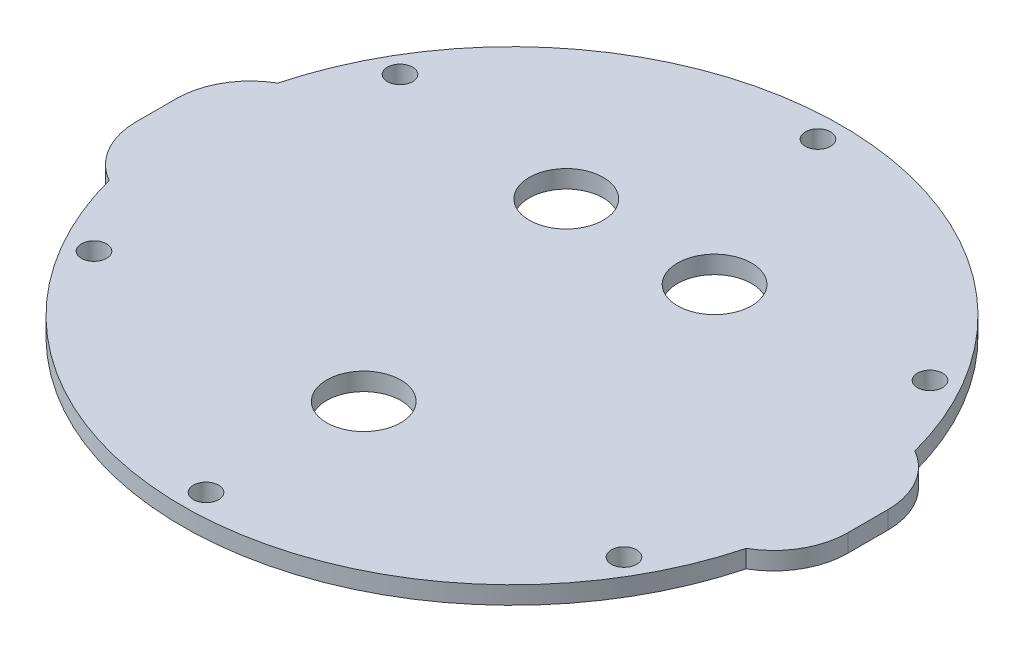
ISO-10303-21;
HEADER;
FILE_DESCRIPTION(('STEP AP214'),'2;1');
FILE_NAME('part.step','',(''),(''),'','','');
FILE_SCHEMA(('AUTOMOTIVE_DESIGN { 1 0 10303 214 1 1 1 1 }'));
ENDSEC;
DATA;
#1=APPLICATION_CONTEXT('core data for automotive mechanical design processes');
#2=APPLICATION_PROTOCOL_DEFINITION('international standard','automotive_design',2000,#1);
#3=PRODUCT_CONTEXT('',#1,'mechanical');
#4=PRODUCT('Part','Part','',(#3));
#5=PRODUCT_RELATED_PRODUCT_CATEGORY('part','',(#4));
#6=PRODUCT_DEFINITION_FORMATION('','',#4);
#7=PRODUCT_DEFINITION_CONTEXT('part definition',#1,'design');
#8=PRODUCT_DEFINITION('design','',#6,#7);
#9=PRODUCT_DEFINITION_SHAPE('','',#8);
#10=(LENGTH_UNIT() NAMED_UNIT(*) SI_UNIT(.MILLI.,.METRE.));
#11=(NAMED_UNIT(*) PLANE_ANGLE_UNIT() SI_UNIT($,.RADIAN.));
#12=(NAMED_UNIT(*) SI_UNIT($,.STERADIAN.) SOLID_ANGLE_UNIT());
#13=UNCERTAINTY_MEASURE_WITH_UNIT(LENGTH_MEASURE(1.E-05),#10,'distance_accuracy_value','');
#14=(GEOMETRIC_REPRESENTATION_CONTEXT(3) GLOBAL_UNCERTAINTY_ASSIGNED_CONTEXT((#13)) GLOBAL_UNIT_ASSIGNED_CONTEXT((#10,
#11,#12)) REPRESENTATION_CONTEXT('',''));
#15=CARTESIAN_POINT('',(0.,0.,0.));
#16=DIRECTION('',(0.,0.,1.));
#17=DIRECTION('',(1.,0.,0.));
#18=AXIS2_PLACEMENT_3D('',#15,#16,#17);
#19=CARTESIAN_POINT('',(-38.,2.4,2.7));
#20=DIRECTION('',(0.,-1.,0.));
#21=DIRECTION('',(0.,0.,-1.));
#22=AXIS2_PLACEMENT_3D('',#19,#20,#21);
#23=CYLINDRICAL_SURFACE('',#22,10.);
#24=CARTESIAN_POINT('',(-38.,0.,2.7));
#25=DIRECTION('',(0.,1.,0.));
#26=DIRECTION('',(0.,0.,1.));
#27=AXIS2_PLACEMENT_3D('',#24,#25,#26);
#28=CIRCLE('',#27,10.);
#29=CARTESIAN_POINT('',(-42.969094343859,0.,11.3780240493922));
#30=VERTEX_POINT('',#29);
#31=CARTESIAN_POINT('',(-48.,0.,2.69999999999993));
#32=VERTEX_POINT('',#31);
#33=EDGE_CURVE('E139',#30,#32,#28,.F.);
#34=ORIENTED_EDGE('',*,*,#33,.F.);
#35=DIRECTION('',(0.,-1.,0.));
#36=VECTOR('',#35,1.);
#37=CARTESIAN_POINT('',(-42.969094343859,2.4,11.3780240493922));
#38=LINE('',#37,#36);
#39=CARTESIAN_POINT('',(-42.969094343859,2.4,11.3780240493922));
#40=VERTEX_POINT('',#39);
#41=EDGE_CURVE('E11',#40,#30,#38,.T.);
#42=ORIENTED_EDGE('',*,*,#41,.F.);
#43=CARTESIAN_POINT('',(-38.,2.4,2.7));
#44=DIRECTION('',(0.,1.,0.));
#45=DIRECTION('',(0.,0.,1.));
#46=AXIS2_PLACEMENT_3D('',#43,#44,#45);
#47=CIRCLE('',#46,10.);
#48=CARTESIAN_POINT('',(-48.,2.4,2.69999999999993));
#49=VERTEX_POINT('',#48);
#50=EDGE_CURVE('E166',#40,#49,#47,.F.);
#51=ORIENTED_EDGE('',*,*,#50,.T.);
#52=DIRECTION('',(0.,-1.,0.));
#53=VECTOR('',#52,1.);
#54=CARTESIAN_POINT('',(-48.,2.4,2.69999999999993));
#55=LINE('',#54,#53);
#56=EDGE_CURVE('E93',#49,#32,#55,.T.);
#57=ORIENTED_EDGE('',*,*,#56,.T.);
#58=EDGE_LOOP('',(#34,#42,#51,#57));
#59=FACE_BOUND('',#58,.T.);
#60=ADVANCED_FACE('F41',(#59),#23,.T.);
#61=CARTESIAN_POINT('',(0.,2.4,0.));
#62=DIRECTION('',(0.,-1.,0.));
#63=DIRECTION('',(0.,0.,-1.));
#64=AXIS2_PLACEMENT_3D('',#61,#62,#63);
#65=CYLINDRICAL_SURFACE('',#64,44.45);
#66=CARTESIAN_POINT('',(0.,0.,0.));
#67=DIRECTION('',(0.,1.,0.));
#68=DIRECTION('',(0.,0.,1.));
#69=AXIS2_PLACEMENT_3D('',#66,#67,#68);
#70=CIRCLE('',#69,44.45);
#71=CARTESIAN_POINT('',(42.969094343859,0.,11.3780240493922));
#72=VERTEX_POINT('',#71);
#73=EDGE_CURVE('E143',#30,#72,#70,.T.);
#74=ORIENTED_EDGE('',*,*,#73,.T.);
#75=DIRECTION('',(0.,-1.,0.));
#76=VECTOR('',#75,1.);
#77=CARTESIAN_POINT('',(42.969094343859,2.4,11.3780240493922));
#78=LINE('',#77,#76);
#79=CARTESIAN_POINT('',(42.969094343859,2.4,11.3780240493922));
#80=VERTEX_POINT('',#79);
#81=EDGE_CURVE('E50',#80,#72,#78,.T.);
#82=ORIENTED_EDGE('',*,*,#81,.F.);
#83=CARTESIAN_POINT('',(0.,2.4,0.));
#84=DIRECTION('',(0.,1.,0.));
#85=DIRECTION('',(0.,0.,1.));
#86=AXIS2_PLACEMENT_3D('',#83,#84,#85);
#87=CIRCLE('',#86,44.45);
#88=EDGE_CURVE('E201',#40,#80,#87,.T.);
#89=ORIENTED_EDGE('',*,*,#88,.F.);
#90=ORIENTED_EDGE('',*,*,#41,.T.);
#91=EDGE_LOOP('',(#74,#82,#89,#90));
#92=FACE_BOUND('',#91,.T.);
#93=ADVANCED_FACE('F325',(#92),#65,.T.);
#94=CARTESIAN_POINT('',(38.,2.4,2.7));
#95=DIRECTION('',(0.,-1.,0.));
#96=DIRECTION('',(0.,0.,-1.));
#97=AXIS2_PLACEMENT_3D('',#94,#95,#96);
#98=CYLINDRICAL_SURFACE('',#97,10.);
#99=CARTESIAN_POINT('',(38.,0.,2.7));
#100=DIRECTION('',(0.,1.,0.));
#101=DIRECTION('',(0.,0.,1.));
#102=AXIS2_PLACEMENT_3D('',#99,#100,#101);
#103=CIRCLE('',#102,10.);
#104=CARTESIAN_POINT('',(48.,0.,2.69999999999993));
#105=VERTEX_POINT('',#104);
#106=EDGE_CURVE('E147',#72,#105,#103,.T.);
#107=ORIENTED_EDGE('',*,*,#106,.T.);
#108=DIRECTION('',(0.,-1.,0.));
#109=VECTOR('',#108,1.);
#110=CARTESIAN_POINT('',(48.,2.4,2.69999999999993));
#111=LINE('',#110,#109);
#112=CARTESIAN_POINT('',(48.,2.4,2.69999999999993));
#113=VERTEX_POINT('',#112);
#114=EDGE_CURVE('E176',#113,#105,#111,.T.);
#115=ORIENTED_EDGE('',*,*,#114,.F.);
#116=CARTESIAN_POINT('',(38.,2.4,2.7));
#117=DIRECTION('',(0.,1.,0.));
#118=DIRECTION('',(0.,0.,1.));
#119=AXIS2_PLACEMENT_3D('',#116,#117,#118);
#120=CIRCLE('',#119,10.);
#121=EDGE_CURVE('E186',#80,#113,#120,.T.);
#122=ORIENTED_EDGE('',*,*,#121,.F.);
#123=ORIENTED_EDGE('',*,*,#81,.T.);
#124=EDGE_LOOP('',(#107,#115,#122,#123));
#125=FACE_BOUND('',#124,.T.);
#126=ADVANCED_FACE('F184',(#125),#98,.T.);
#127=CARTESIAN_POINT('',(48.,2.4,0.));
#128=DIRECTION('',(1.,0.,0.));
#129=DIRECTION('',(0.,0.,-1.));
#130=AXIS2_PLACEMENT_3D('',#127,#128,#129);
#131=PLANE('',#130);
#132=DIRECTION('',(0.,0.,1.));
#133=VECTOR('',#132,1.);
#134=CARTESIAN_POINT('',(48.,0.,0.));
#135=LINE('',#134,#133);
#136=CARTESIAN_POINT('',(48.,0.,-2.69999999999993));
#137=VERTEX_POINT('',#136);
#138=EDGE_CURVE('E151',#137,#105,#135,.T.);
#139=ORIENTED_EDGE('',*,*,#138,.F.);
#140=DIRECTION('',(0.,-1.,0.));
#141=VECTOR('',#140,1.);
#142=CARTESIAN_POINT('',(48.,2.4,-2.69999999999993));
#143=LINE('',#142,#141);
#144=CARTESIAN_POINT('',(48.,2.4,-2.69999999999993));
#145=VERTEX_POINT('',#144);
#146=EDGE_CURVE('E173',#145,#137,#143,.T.);
#147=ORIENTED_EDGE('',*,*,#146,.F.);
#148=DIRECTION('',(0.,0.,1.));
#149=VECTOR('',#148,1.);
#150=CARTESIAN_POINT('',(48.,2.4,0.));
#151=LINE('',#150,#149);
#152=EDGE_CURVE('E196',#145,#113,#151,.T.);
#153=ORIENTED_EDGE('',*,*,#152,.T.);
#154=ORIENTED_EDGE('',*,*,#114,.T.);
#155=EDGE_LOOP('',(#139,#147,#153,#154));
#156=FACE_BOUND('',#155,.T.);
#157=ADVANCED_FACE('F194',(#156),#131,.T.);
#158=CARTESIAN_POINT('',(38.,2.4,-2.7));
#159=DIRECTION('',(0.,-1.,0.));
#160=DIRECTION('',(0.,0.,-1.));
#161=AXIS2_PLACEMENT_3D('',#158,#159,#160);
#162=CYLINDRICAL_SURFACE('',#161,10.);
#163=CARTESIAN_POINT('',(38.,0.,-2.7));
#164=DIRECTION('',(0.,1.,0.));
#165=DIRECTION('',(0.,0.,1.));
#166=AXIS2_PLACEMENT_3D('',#163,#164,#165);
#167=CIRCLE('',#166,10.);
#168=CARTESIAN_POINT('',(42.969094343859,0.,-11.3780240493922));
#169=VERTEX_POINT('',#168);
#170=EDGE_CURVE('E155',#169,#137,#167,.F.);
#171=ORIENTED_EDGE('',*,*,#170,.F.);
#172=DIRECTION('',(0.,-1.,0.));
#173=VECTOR('',#172,1.);
#174=CARTESIAN_POINT('',(42.969094343859,2.4,-11.3780240493922));
#175=LINE('',#174,#173);
#176=CARTESIAN_POINT('',(42.969094343859,2.4,-11.3780240493922));
#177=VERTEX_POINT('',#176);
#178=EDGE_CURVE('E129',#177,#169,#175,.T.);
#179=ORIENTED_EDGE('',*,*,#178,.F.);
#180=CARTESIAN_POINT('',(38.,2.4,-2.7));
#181=DIRECTION('',(0.,1.,0.));
#182=DIRECTION('',(0.,0.,1.));
#183=AXIS2_PLACEMENT_3D('',#180,#181,#182);
#184=CIRCLE('',#183,10.);
#185=EDGE_CURVE('E120',#177,#145,#184,.F.);
#186=ORIENTED_EDGE('',*,*,#185,.T.);
#187=ORIENTED_EDGE('',*,*,#146,.T.);
#188=EDGE_LOOP('',(#171,#179,#186,#187));
#189=FACE_BOUND('',#188,.T.);
#190=ADVANCED_FACE('F340',(#189),#162,.T.);
#191=CARTESIAN_POINT('',(0.,2.4,0.));
#192=DIRECTION('',(0.,-1.,0.));
#193=DIRECTION('',(0.,0.,-1.));
#194=AXIS2_PLACEMENT_3D('',#191,#192,#193);
#195=CYLINDRICAL_SURFACE('',#194,44.45);
#196=CARTESIAN_POINT('',(0.,0.,0.));
#197=DIRECTION('',(0.,1.,0.));
#198=DIRECTION('',(0.,0.,1.));
#199=AXIS2_PLACEMENT_3D('',#196,#197,#198);
#200=CIRCLE('',#199,44.45);
#201=CARTESIAN_POINT('',(-42.969094343859,0.,-11.3780240493922));
#202=VERTEX_POINT('',#201);
#203=EDGE_CURVE('E127',#169,#202,#200,.T.);
#204=ORIENTED_EDGE('',*,*,#203,.T.);
#205=DIRECTION('',(0.,-1.,0.));
#206=VECTOR('',#205,1.);
#207=CARTESIAN_POINT('',(-42.969094343859,2.4,-11.3780240493922));
#208=LINE('',#207,#206);
#209=CARTESIAN_POINT('',(-42.969094343859,2.4,-11.3780240493922));
#210=VERTEX_POINT('',#209);
#211=EDGE_CURVE('E124',#210,#202,#208,.T.);
#212=ORIENTED_EDGE('',*,*,#211,.F.);
#213=CARTESIAN_POINT('',(0.,2.4,0.));
#214=DIRECTION('',(0.,1.,0.));
#215=DIRECTION('',(0.,0.,1.));
#216=AXIS2_PLACEMENT_3D('',#213,#214,#215);
#217=CIRCLE('',#216,44.45);
#218=EDGE_CURVE('E113',#177,#210,#217,.T.);
#219=ORIENTED_EDGE('',*,*,#218,.F.);
#220=ORIENTED_EDGE('',*,*,#178,.T.);
#221=EDGE_LOOP('',(#204,#212,#219,#220));
#222=FACE_BOUND('',#221,.T.);
#223=ADVANCED_FACE('F125',(#222),#195,.T.);
#224=CARTESIAN_POINT('',(-38.,2.4,-2.7));
#225=DIRECTION('',(0.,-1.,0.));
#226=DIRECTION('',(0.,0.,-1.));
#227=AXIS2_PLACEMENT_3D('',#224,#225,#226);
#228=CYLINDRICAL_SURFACE('',#227,10.);
#229=CARTESIAN_POINT('',(-38.,0.,-2.7));
#230=DIRECTION('',(0.,1.,0.));
#231=DIRECTION('',(0.,0.,1.));
#232=AXIS2_PLACEMENT_3D('',#229,#230,#231);
#233=CIRCLE('',#232,10.);
#234=CARTESIAN_POINT('',(-48.,0.,-2.69999999999993));
#235=VERTEX_POINT('',#234);
#236=EDGE_CURVE('E86',#202,#235,#233,.T.);
#237=ORIENTED_EDGE('',*,*,#236,.T.);
#238=DIRECTION('',(0.,-1.,0.));
#239=VECTOR('',#238,1.);
#240=CARTESIAN_POINT('',(-48.,2.4,-2.69999999999993));
#241=LINE('',#240,#239);
#242=CARTESIAN_POINT('',(-48.,2.4,-2.69999999999993));
#243=VERTEX_POINT('',#242);
#244=EDGE_CURVE('E130',#243,#235,#241,.T.);
#245=ORIENTED_EDGE('',*,*,#244,.F.);
#246=CARTESIAN_POINT('',(-38.,2.4,-2.7));
#247=DIRECTION('',(0.,1.,0.));
#248=DIRECTION('',(0.,0.,1.));
#249=AXIS2_PLACEMENT_3D('',#246,#247,#248);
#250=CIRCLE('',#249,10.);
#251=EDGE_CURVE('E117',#210,#243,#250,.T.);
#252=ORIENTED_EDGE('',*,*,#251,.F.);
#253=ORIENTED_EDGE('',*,*,#211,.T.);
#254=EDGE_LOOP('',(#237,#245,#252,#253));
#255=FACE_BOUND('',#254,.T.);
#256=ADVANCED_FACE('F132',(#255),#228,.T.);
#257=CARTESIAN_POINT('',(-48.,2.4,0.));
#258=DIRECTION('',(1.,0.,0.));
#259=DIRECTION('',(0.,0.,-1.));
#260=AXIS2_PLACEMENT_3D('',#257,#258,#259);
#261=PLANE('',#260);
#262=DIRECTION('',(0.,0.,1.));
#263=VECTOR('',#262,1.);
#264=CARTESIAN_POINT('',(-48.,0.,0.));
#265=LINE('',#264,#263);
#266=EDGE_CURVE('E163',#235,#32,#265,.T.);
#267=ORIENTED_EDGE('',*,*,#266,.T.);
#268=ORIENTED_EDGE('',*,*,#56,.F.);
#269=DIRECTION('',(0.,0.,1.));
#270=VECTOR('',#269,1.);
#271=CARTESIAN_POINT('',(-48.,2.4,0.));
#272=LINE('',#271,#270);
#273=EDGE_CURVE('E58',#243,#49,#272,.T.);
#274=ORIENTED_EDGE('',*,*,#273,.F.);
#275=ORIENTED_EDGE('',*,*,#244,.T.);
#276=EDGE_LOOP('',(#267,#268,#274,#275));
#277=FACE_BOUND('',#276,.T.);
#278=ADVANCED_FACE('F292',(#277),#261,.F.);
#279=CARTESIAN_POINT('',(0.,2.4,0.));
#280=DIRECTION('',(0.,1.,0.));
#281=DIRECTION('',(0.,0.,1.));
#282=AXIS2_PLACEMENT_3D('',#279,#280,#281);
#283=PLANE('',#282);
#284=CARTESIAN_POINT('',(10.,2.4,-17.3205080756888));
#285=DIRECTION('',(0.,1.,0.));
#286=DIRECTION('',(0.,0.,-1.));
#287=AXIS2_PLACEMENT_3D('',#284,#285,#286);
#288=CIRCLE('',#287,5.);
#289=CARTESIAN_POINT('',(10.,2.4,-22.3205080756888));
#290=VERTEX_POINT('',#289);
#291=EDGE_CURVE('E264',#290,#290,#288,.T.);
#292=ORIENTED_EDGE('',*,*,#291,.F.);
#293=EDGE_LOOP('',(#292));
#294=FACE_BOUND('',#293,.T.);
#295=CARTESIAN_POINT('',(0.,2.4,20.));
#296=DIRECTION('',(0.,1.,0.));
#297=DIRECTION('',(0.,0.,1.));
#298=AXIS2_PLACEMENT_3D('',#295,#296,#297);
#299=CIRCLE('',#298,5.);
#300=CARTESIAN_POINT('',(0.,2.4,25.));
#301=VERTEX_POINT('',#300);
#302=EDGE_CURVE('E272',#301,#301,#299,.T.);
#303=ORIENTED_EDGE('',*,*,#302,.F.);
#304=EDGE_LOOP('',(#303));
#305=FACE_BOUND('',#304,.T.);
#306=CARTESIAN_POINT('',(-10.,2.4,-17.3205080756888));
#307=DIRECTION('',(0.,1.,0.));
#308=DIRECTION('',(0.,0.,1.));
#309=AXIS2_PLACEMENT_3D('',#306,#307,#308);
#310=CIRCLE('',#309,5.);
#311=CARTESIAN_POINT('',(-10.,2.4,-12.3205080756888));
#312=VERTEX_POINT('',#311);
#313=EDGE_CURVE('E256',#312,#312,#310,.T.);
#314=ORIENTED_EDGE('',*,*,#313,.F.);
#315=EDGE_LOOP('',(#314));
#316=FACE_BOUND('',#315,.T.);
#317=CARTESIAN_POINT('',(35.7451985412025,2.4,-20.6375000000004));
#318=DIRECTION('',(0.,1.,0.));
#319=DIRECTION('',(0.,0.,1.));
#320=AXIS2_PLACEMENT_3D('',#317,#318,#319);
#321=CIRCLE('',#320,1.69999999999999);
#322=CARTESIAN_POINT('',(35.7451985412025,2.4,-18.9375000000004));
#323=VERTEX_POINT('',#322);
#324=EDGE_CURVE('E251',#323,#323,#321,.T.);
#325=ORIENTED_EDGE('',*,*,#324,.F.);
#326=EDGE_LOOP('',(#325));
#327=FACE_BOUND('',#326,.T.);
#328=CARTESIAN_POINT('',(35.7451985412029,2.4,20.6374999999997));
#329=DIRECTION('',(0.,1.,0.));
#330=DIRECTION('',(0.,0.,1.));
#331=AXIS2_PLACEMENT_3D('',#328,#329,#330);
#332=CIRCLE('',#331,1.69999999999999);
#333=CARTESIAN_POINT('',(35.7451985412029,2.4,22.3374999999997));
#334=VERTEX_POINT('',#333);
#335=EDGE_CURVE('E243',#334,#334,#332,.T.);
#336=ORIENTED_EDGE('',*,*,#335,.F.);
#337=EDGE_LOOP('',(#336));
#338=FACE_BOUND('',#337,.T.);
#339=CARTESIAN_POINT('',(0.,2.4,41.275));
#340=DIRECTION('',(0.,1.,0.));
#341=DIRECTION('',(0.,0.,1.));
#342=AXIS2_PLACEMENT_3D('',#339,#340,#341);
#343=CIRCLE('',#342,1.69999999999999);
#344=CARTESIAN_POINT('',(0.,2.4,42.975));
#345=VERTEX_POINT('',#344);
#346=EDGE_CURVE('E235',#345,#345,#343,.T.);
#347=ORIENTED_EDGE('',*,*,#346,.F.);
#348=EDGE_LOOP('',(#347));
#349=FACE_BOUND('',#348,.T.);
#350=CARTESIAN_POINT('',(-35.7451985412026,2.4,20.6375000000002));
#351=DIRECTION('',(0.,1.,0.));
#352=DIRECTION('',(0.,0.,1.));
#353=AXIS2_PLACEMENT_3D('',#350,#351,#352);
#354=CIRCLE('',#353,1.69999999999999);
#355=CARTESIAN_POINT('',(-35.7451985412026,2.4,22.3375000000002));
#356=VERTEX_POINT('',#355);
#357=EDGE_CURVE('E227',#356,#356,#354,.T.);
#358=ORIENTED_EDGE('',*,*,#357,.F.);
#359=EDGE_LOOP('',(#358));
#360=FACE_BOUND('',#359,.T.);
#361=CARTESIAN_POINT('',(-35.7451985412028,2.4,-20.6374999999999));
#362=DIRECTION('',(0.,1.,0.));
#363=DIRECTION('',(0.,0.,1.));
#364=AXIS2_PLACEMENT_3D('',#361,#362,#363);
#365=CIRCLE('',#364,1.69999999999999);
#366=CARTESIAN_POINT('',(-35.7451985412028,2.4,-18.9374999999999));
#367=VERTEX_POINT('',#366);
#368=EDGE_CURVE('E219',#367,#367,#365,.T.);
#369=ORIENTED_EDGE('',*,*,#368,.F.);
#370=EDGE_LOOP('',(#369));
#371=FACE_BOUND('',#370,.T.);
#372=CARTESIAN_POINT('',(0.,2.4,-41.275));
#373=DIRECTION('',(0.,1.,0.));
#374=DIRECTION('',(0.,0.,1.));
#375=AXIS2_PLACEMENT_3D('',#372,#373,#374);
#376=CIRCLE('',#375,1.69999999999999);
#377=CARTESIAN_POINT('',(0.,2.4,-39.575));
#378=VERTEX_POINT('',#377);
#379=EDGE_CURVE('E211',#378,#378,#376,.T.);
#380=ORIENTED_EDGE('',*,*,#379,.F.);
#381=EDGE_LOOP('',(#380));
#382=FACE_BOUND('',#381,.T.);
#383=ORIENTED_EDGE('',*,*,#50,.F.);
#384=ORIENTED_EDGE('',*,*,#88,.T.);
#385=ORIENTED_EDGE('',*,*,#121,.T.);
#386=ORIENTED_EDGE('',*,*,#152,.F.);
#387=ORIENTED_EDGE('',*,*,#185,.F.);
#388=ORIENTED_EDGE('',*,*,#218,.T.);
#389=ORIENTED_EDGE('',*,*,#251,.T.);
#390=ORIENTED_EDGE('',*,*,#273,.T.);
#391=EDGE_LOOP('',(#383,#384,#385,#386,#387,#388,#389,#390));
#392=FACE_BOUND('',#391,.T.);
#393=ADVANCED_FACE('F115',(#294,#305,#316,#327,#338,#349,#360,#371,#382,#392),#283,.T.);
#394=CARTESIAN_POINT('',(0.,0.,0.));
#395=DIRECTION('',(0.,1.,0.));
#396=DIRECTION('',(0.,0.,1.));
#397=AXIS2_PLACEMENT_3D('',#394,#395,#396);
#398=PLANE('',#397);
#399=CARTESIAN_POINT('',(10.,0.,-17.3205080756888));
#400=DIRECTION('',(0.,1.,0.));
#401=DIRECTION('',(0.,0.,-1.));
#402=AXIS2_PLACEMENT_3D('',#399,#400,#401);
#403=CIRCLE('',#402,5.);
#404=CARTESIAN_POINT('',(10.,0.,-22.3205080756888));
#405=VERTEX_POINT('',#404);
#406=EDGE_CURVE('E268',#405,#405,#403,.T.);
#407=ORIENTED_EDGE('',*,*,#406,.T.);
#408=EDGE_LOOP('',(#407));
#409=FACE_BOUND('',#408,.T.);
#410=CARTESIAN_POINT('',(0.,0.,20.));
#411=DIRECTION('',(0.,1.,0.));
#412=DIRECTION('',(0.,0.,1.));
#413=AXIS2_PLACEMENT_3D('',#410,#411,#412);
#414=CIRCLE('',#413,5.);
#415=CARTESIAN_POINT('',(0.,0.,25.));
#416=VERTEX_POINT('',#415);
#417=EDGE_CURVE('E260',#416,#416,#414,.T.);
#418=ORIENTED_EDGE('',*,*,#417,.T.);
#419=EDGE_LOOP('',(#418));
#420=FACE_BOUND('',#419,.T.);
#421=CARTESIAN_POINT('',(-10.,0.,-17.3205080756888));
#422=DIRECTION('',(0.,1.,0.));
#423=DIRECTION('',(0.,0.,1.));
#424=AXIS2_PLACEMENT_3D('',#421,#422,#423);
#425=CIRCLE('',#424,5.);
#426=CARTESIAN_POINT('',(-10.,0.,-12.3205080756888));
#427=VERTEX_POINT('',#426);
#428=EDGE_CURVE('E255',#427,#427,#425,.T.);
#429=ORIENTED_EDGE('',*,*,#428,.T.);
#430=EDGE_LOOP('',(#429));
#431=FACE_BOUND('',#430,.T.);
#432=CARTESIAN_POINT('',(35.7451985412025,0.,-20.6375000000004));
#433=DIRECTION('',(0.,1.,0.));
#434=DIRECTION('',(0.,0.,1.));
#435=AXIS2_PLACEMENT_3D('',#432,#433,#434);
#436=CIRCLE('',#435,1.7);
#437=CARTESIAN_POINT('',(35.7451985412025,0.,-18.9375000000004));
#438=VERTEX_POINT('',#437);
#439=EDGE_CURVE('E247',#438,#438,#436,.T.);
#440=ORIENTED_EDGE('',*,*,#439,.T.);
#441=EDGE_LOOP('',(#440));
#442=FACE_BOUND('',#441,.T.);
#443=CARTESIAN_POINT('',(35.7451985412029,0.,20.6374999999997));
#444=DIRECTION('',(0.,1.,0.));
#445=DIRECTION('',(0.,0.,1.));
#446=AXIS2_PLACEMENT_3D('',#443,#444,#445);
#447=CIRCLE('',#446,1.7);
#448=CARTESIAN_POINT('',(35.7451985412029,0.,22.3374999999997));
#449=VERTEX_POINT('',#448);
#450=EDGE_CURVE('E239',#449,#449,#447,.T.);
#451=ORIENTED_EDGE('',*,*,#450,.T.);
#452=EDGE_LOOP('',(#451));
#453=FACE_BOUND('',#452,.T.);
#454=CARTESIAN_POINT('',(0.,0.,41.275));
#455=DIRECTION('',(0.,1.,0.));
#456=DIRECTION('',(0.,0.,1.));
#457=AXIS2_PLACEMENT_3D('',#454,#455,#456);
#458=CIRCLE('',#457,1.7);
#459=CARTESIAN_POINT('',(0.,0.,42.975));
#460=VERTEX_POINT('',#459);
#461=EDGE_CURVE('E231',#460,#460,#458,.T.);
#462=ORIENTED_EDGE('',*,*,#461,.T.);
#463=EDGE_LOOP('',(#462));
#464=FACE_BOUND('',#463,.T.);
#465=CARTESIAN_POINT('',(-35.7451985412026,0.,20.6375000000002));
#466=DIRECTION('',(0.,1.,0.));
#467=DIRECTION('',(0.,0.,1.));
#468=AXIS2_PLACEMENT_3D('',#465,#466,#467);
#469=CIRCLE('',#468,1.7);
#470=CARTESIAN_POINT('',(-35.7451985412026,0.,22.3375000000002));
#471=VERTEX_POINT('',#470);
#472=EDGE_CURVE('E223',#471,#471,#469,.T.);
#473=ORIENTED_EDGE('',*,*,#472,.T.);
#474=EDGE_LOOP('',(#473));
#475=FACE_BOUND('',#474,.T.);
#476=CARTESIAN_POINT('',(-35.7451985412028,0.,-20.6374999999999));
#477=DIRECTION('',(0.,1.,0.));
#478=DIRECTION('',(0.,0.,1.));
#479=AXIS2_PLACEMENT_3D('',#476,#477,#478);
#480=CIRCLE('',#479,1.7);
#481=CARTESIAN_POINT('',(-35.7451985412028,0.,-18.9374999999999));
#482=VERTEX_POINT('',#481);
#483=EDGE_CURVE('E215',#482,#482,#480,.T.);
#484=ORIENTED_EDGE('',*,*,#483,.T.);
#485=EDGE_LOOP('',(#484));
#486=FACE_BOUND('',#485,.T.);
#487=CARTESIAN_POINT('',(0.,0.,-41.275));
#488=DIRECTION('',(0.,1.,0.));
#489=DIRECTION('',(0.,0.,1.));
#490=AXIS2_PLACEMENT_3D('',#487,#488,#489);
#491=CIRCLE('',#490,1.7);
#492=CARTESIAN_POINT('',(0.,0.,-39.575));
#493=VERTEX_POINT('',#492);
#494=EDGE_CURVE('E144',#493,#493,#491,.T.);
#495=ORIENTED_EDGE('',*,*,#494,.T.);
#496=EDGE_LOOP('',(#495));
#497=FACE_BOUND('',#496,.T.);
#498=ORIENTED_EDGE('',*,*,#33,.T.);
#499=ORIENTED_EDGE('',*,*,#266,.F.);
#500=ORIENTED_EDGE('',*,*,#236,.F.);
#501=ORIENTED_EDGE('',*,*,#203,.F.);
#502=ORIENTED_EDGE('',*,*,#170,.T.);
#503=ORIENTED_EDGE('',*,*,#138,.T.);
#504=ORIENTED_EDGE('',*,*,#106,.F.);
#505=ORIENTED_EDGE('',*,*,#73,.F.);
#506=EDGE_LOOP('',(#498,#499,#500,#501,#502,#503,#504,#505));
#507=FACE_BOUND('',#506,.T.);
#508=ADVANCED_FACE('F190',(#409,#420,#431,#442,#453,#464,#475,#486,#497,#507),#398,.F.);
#509=CARTESIAN_POINT('',(0.,2.4,-41.275));
#510=DIRECTION('',(0.,1.,0.));
#511=DIRECTION('',(0.,0.,1.));
#512=AXIS2_PLACEMENT_3D('',#509,#510,#511);
#513=CYLINDRICAL_SURFACE('',#512,1.69999999999999);
#514=ORIENTED_EDGE('',*,*,#494,.F.);
#515=EDGE_LOOP('',(#514));
#516=FACE_BOUND('',#515,.T.);
#517=ORIENTED_EDGE('',*,*,#379,.T.);
#518=EDGE_LOOP('',(#517));
#519=FACE_BOUND('',#518,.T.);
#520=ADVANCED_FACE('F309',(#516,#519),#513,.F.);
#521=CARTESIAN_POINT('',(-35.7451985412028,2.4,-20.6374999999999));
#522=DIRECTION('',(0.,1.,0.));
#523=DIRECTION('',(0.,0.,1.));
#524=AXIS2_PLACEMENT_3D('',#521,#522,#523);
#525=CYLINDRICAL_SURFACE('',#524,1.69999999999999);
#526=ORIENTED_EDGE('',*,*,#483,.F.);
#527=EDGE_LOOP('',(#526));
#528=FACE_BOUND('',#527,.T.);
#529=ORIENTED_EDGE('',*,*,#368,.T.);
#530=EDGE_LOOP('',(#529));
#531=FACE_BOUND('',#530,.T.);
#532=ADVANCED_FACE('F311',(#528,#531),#525,.F.);
#533=CARTESIAN_POINT('',(-35.7451985412026,2.4,20.6375000000002));
#534=DIRECTION('',(0.,1.,0.));
#535=DIRECTION('',(0.,0.,1.));
#536=AXIS2_PLACEMENT_3D('',#533,#534,#535);
#537=CYLINDRICAL_SURFACE('',#536,1.69999999999999);
#538=ORIENTED_EDGE('',*,*,#472,.F.);
#539=EDGE_LOOP('',(#538));
#540=FACE_BOUND('',#539,.T.);
#541=ORIENTED_EDGE('',*,*,#357,.T.);
#542=EDGE_LOOP('',(#541));
#543=FACE_BOUND('',#542,.T.);
#544=ADVANCED_FACE('F318',(#540,#543),#537,.F.);
#545=CARTESIAN_POINT('',(0.,2.4,41.275));
#546=DIRECTION('',(0.,1.,0.));
#547=DIRECTION('',(0.,0.,1.));
#548=AXIS2_PLACEMENT_3D('',#545,#546,#547);
#549=CYLINDRICAL_SURFACE('',#548,1.69999999999999);
#550=ORIENTED_EDGE('',*,*,#461,.F.);
#551=EDGE_LOOP('',(#550));
#552=FACE_BOUND('',#551,.T.);
#553=ORIENTED_EDGE('',*,*,#346,.T.);
#554=EDGE_LOOP('',(#553));
#555=FACE_BOUND('',#554,.T.);
#556=ADVANCED_FACE('F392',(#552,#555),#549,.F.);
#557=CARTESIAN_POINT('',(35.7451985412029,2.4,20.6374999999997));
#558=DIRECTION('',(0.,1.,0.));
#559=DIRECTION('',(0.,0.,1.));
#560=AXIS2_PLACEMENT_3D('',#557,#558,#559);
#561=CYLINDRICAL_SURFACE('',#560,1.69999999999999);
#562=ORIENTED_EDGE('',*,*,#450,.F.);
#563=EDGE_LOOP('',(#562));
#564=FACE_BOUND('',#563,.T.);
#565=ORIENTED_EDGE('',*,*,#335,.T.);
#566=EDGE_LOOP('',(#565));
#567=FACE_BOUND('',#566,.T.);
#568=ADVANCED_FACE('F402',(#564,#567),#561,.F.);
#569=CARTESIAN_POINT('',(35.7451985412025,2.4,-20.6375000000004));
#570=DIRECTION('',(0.,1.,0.));
#571=DIRECTION('',(0.,0.,1.));
#572=AXIS2_PLACEMENT_3D('',#569,#570,#571);
#573=CYLINDRICAL_SURFACE('',#572,1.69999999999999);
#574=ORIENTED_EDGE('',*,*,#439,.F.);
#575=EDGE_LOOP('',(#574));
#576=FACE_BOUND('',#575,.T.);
#577=ORIENTED_EDGE('',*,*,#324,.T.);
#578=EDGE_LOOP('',(#577));
#579=FACE_BOUND('',#578,.T.);
#580=ADVANCED_FACE('F412',(#576,#579),#573,.F.);
#581=CARTESIAN_POINT('',(-10.,0.,-17.3205080756888));
#582=DIRECTION('',(0.,1.,0.));
#583=DIRECTION('',(0.,0.,1.));
#584=AXIS2_PLACEMENT_3D('',#581,#582,#583);
#585=CYLINDRICAL_SURFACE('',#584,5.);
#586=ORIENTED_EDGE('',*,*,#428,.F.);
#587=EDGE_LOOP('',(#586));
#588=FACE_BOUND('',#587,.T.);
#589=ORIENTED_EDGE('',*,*,#313,.T.);
#590=EDGE_LOOP('',(#589));
#591=FACE_BOUND('',#590,.T.);
#592=ADVANCED_FACE('F286',(#588,#591),#585,.F.);
#593=CARTESIAN_POINT('',(0.,0.,20.));
#594=DIRECTION('',(0.,1.,0.));
#595=DIRECTION('',(0.,0.,1.));
#596=AXIS2_PLACEMENT_3D('',#593,#594,#595);
#597=CYLINDRICAL_SURFACE('',#596,5.);
#598=ORIENTED_EDGE('',*,*,#417,.F.);
#599=EDGE_LOOP('',(#598));
#600=FACE_BOUND('',#599,.T.);
#601=ORIENTED_EDGE('',*,*,#302,.T.);
#602=EDGE_LOOP('',(#601));
#603=FACE_BOUND('',#602,.T.);
#604=ADVANCED_FACE('F282',(#600,#603),#597,.F.);
#605=CARTESIAN_POINT('',(10.,0.,-17.3205080756888));
#606=DIRECTION('',(0.,1.,0.));
#607=DIRECTION('',(0.,0.,1.));
#608=AXIS2_PLACEMENT_3D('',#605,#606,#607);
#609=CYLINDRICAL_SURFACE('',#608,5.);
#610=ORIENTED_EDGE('',*,*,#406,.F.);
#611=EDGE_LOOP('',(#610));
#612=FACE_BOUND('',#611,.T.);
#613=ORIENTED_EDGE('',*,*,#291,.T.);
#614=EDGE_LOOP('',(#613));
#615=FACE_BOUND('',#614,.T.);
#616=ADVANCED_FACE('F285',(#612,#615),#609,.F.);
#617=CLOSED_SHELL('',(#60,#93,#126,#157,#190,#223,#256,#278,#393,#508,#520,#532,#544,#556,#568,
#580,#592,#604,#616));
#618=MANIFOLD_SOLID_BREP('B2',#617);
#619=ADVANCED_BREP_SHAPE_REPRESENTATION('',(#18,#618),#14);
#620=SHAPE_DEFINITION_REPRESENTATION(#9,#619);
ENDSEC;
END-ISO-10303-21;
